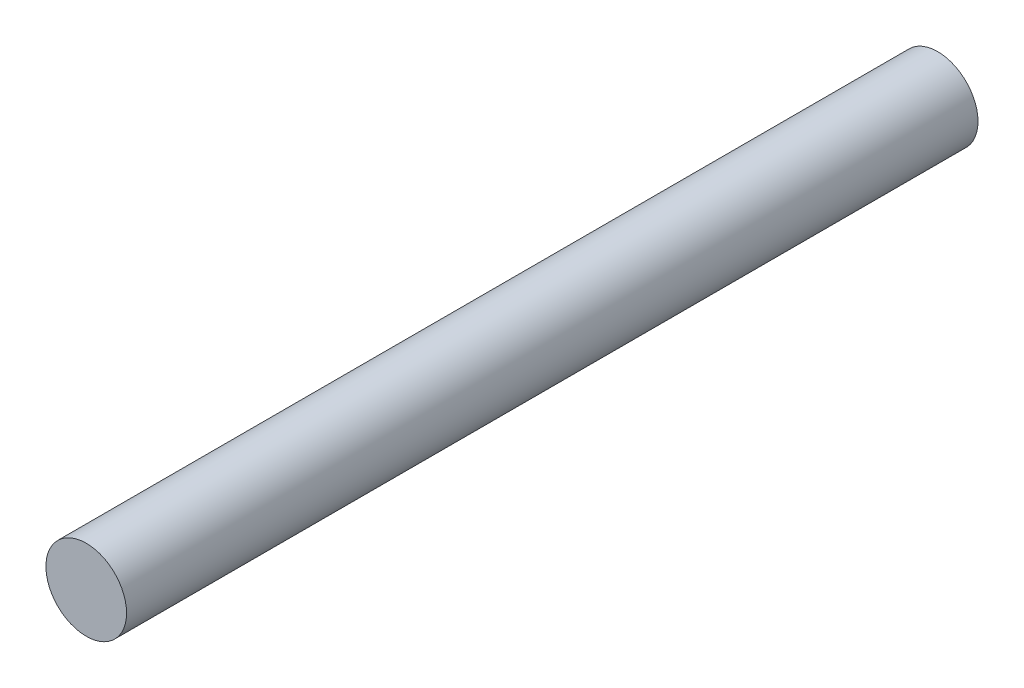
ISO-10303-21;
HEADER;
FILE_DESCRIPTION(('STEP AP214'),'2;1');
FILE_NAME('part.step','',(''),(''),'','','');
FILE_SCHEMA(('AUTOMOTIVE_DESIGN { 1 0 10303 214 1 1 1 1 }'));
ENDSEC;
DATA;
#1=APPLICATION_CONTEXT('core data for automotive mechanical design processes');
#2=APPLICATION_PROTOCOL_DEFINITION('international standard','automotive_design',2000,#1);
#3=PRODUCT_CONTEXT('',#1,'mechanical');
#4=PRODUCT('Part','Part','',(#3));
#5=PRODUCT_RELATED_PRODUCT_CATEGORY('part','',(#4));
#6=PRODUCT_DEFINITION_FORMATION('','',#4);
#7=PRODUCT_DEFINITION_CONTEXT('part definition',#1,'design');
#8=PRODUCT_DEFINITION('design','',#6,#7);
#9=PRODUCT_DEFINITION_SHAPE('','',#8);
#10=(LENGTH_UNIT() NAMED_UNIT(*) SI_UNIT(.MILLI.,.METRE.));
#11=(NAMED_UNIT(*) PLANE_ANGLE_UNIT() SI_UNIT($,.RADIAN.));
#12=(NAMED_UNIT(*) SI_UNIT($,.STERADIAN.) SOLID_ANGLE_UNIT());
#13=UNCERTAINTY_MEASURE_WITH_UNIT(LENGTH_MEASURE(1.E-05),#10,'distance_accuracy_value','');
#14=(GEOMETRIC_REPRESENTATION_CONTEXT(3) GLOBAL_UNCERTAINTY_ASSIGNED_CONTEXT((#13)) GLOBAL_UNIT_ASSIGNED_CONTEXT((#10,
#11,#12)) REPRESENTATION_CONTEXT('',''));
#15=CARTESIAN_POINT('',(0.,0.,0.));
#16=DIRECTION('',(0.,0.,1.));
#17=DIRECTION('',(1.,0.,0.));
#18=AXIS2_PLACEMENT_3D('',#15,#16,#17);
#19=CARTESIAN_POINT('',(0.,0.,33.528));
#20=DIRECTION('',(0.,0.,-1.));
#21=DIRECTION('',(-1.,0.,0.));
#22=AXIS2_PLACEMENT_3D('',#19,#20,#21);
#23=CYLINDRICAL_SURFACE('',#22,1.5875);
#24=CARTESIAN_POINT('',(0.,0.,33.528));
#25=DIRECTION('',(0.,0.,1.));
#26=DIRECTION('',(1.,0.,0.));
#27=AXIS2_PLACEMENT_3D('',#24,#25,#26);
#28=CIRCLE('',#27,1.5875);
#29=CARTESIAN_POINT('',(1.5875,0.,33.528));
#30=VERTEX_POINT('',#29);
#31=EDGE_CURVE('E10',#30,#30,#28,.T.);
#32=ORIENTED_EDGE('',*,*,#31,.F.);
#33=EDGE_LOOP('',(#32));
#34=FACE_BOUND('',#33,.T.);
#35=CARTESIAN_POINT('',(0.,0.,0.));
#36=DIRECTION('',(0.,0.,1.));
#37=DIRECTION('',(1.,0.,0.));
#38=AXIS2_PLACEMENT_3D('',#35,#36,#37);
#39=CIRCLE('',#38,1.5875);
#40=CARTESIAN_POINT('',(1.5875,0.,0.));
#41=VERTEX_POINT('',#40);
#42=EDGE_CURVE('E36',#41,#41,#39,.T.);
#43=ORIENTED_EDGE('',*,*,#42,.T.);
#44=EDGE_LOOP('',(#43));
#45=FACE_BOUND('',#44,.T.);
#46=ADVANCED_FACE('F33',(#34,#45),#23,.T.);
#47=CARTESIAN_POINT('',(0.,0.,33.528));
#48=DIRECTION('',(0.,0.,1.));
#49=DIRECTION('',(1.,0.,0.));
#50=AXIS2_PLACEMENT_3D('',#47,#48,#49);
#51=PLANE('',#50);
#52=ORIENTED_EDGE('',*,*,#31,.T.);
#53=EDGE_LOOP('',(#52));
#54=FACE_BOUND('',#53,.T.);
#55=ADVANCED_FACE('F48',(#54),#51,.T.);
#56=CARTESIAN_POINT('',(0.,0.,0.));
#57=DIRECTION('',(0.,0.,1.));
#58=DIRECTION('',(1.,0.,0.));
#59=AXIS2_PLACEMENT_3D('',#56,#57,#58);
#60=PLANE('',#59);
#61=ORIENTED_EDGE('',*,*,#42,.F.);
#62=EDGE_LOOP('',(#61));
#63=FACE_BOUND('',#62,.T.);
#64=ADVANCED_FACE('F46',(#63),#60,.F.);
#65=CLOSED_SHELL('',(#46,#55,#64));
#66=MANIFOLD_SOLID_BREP('B2',#65);
#67=ADVANCED_BREP_SHAPE_REPRESENTATION('',(#18,#66),#14);
#68=SHAPE_DEFINITION_REPRESENTATION(#9,#67);
ENDSEC;
END-ISO-10303-21;
